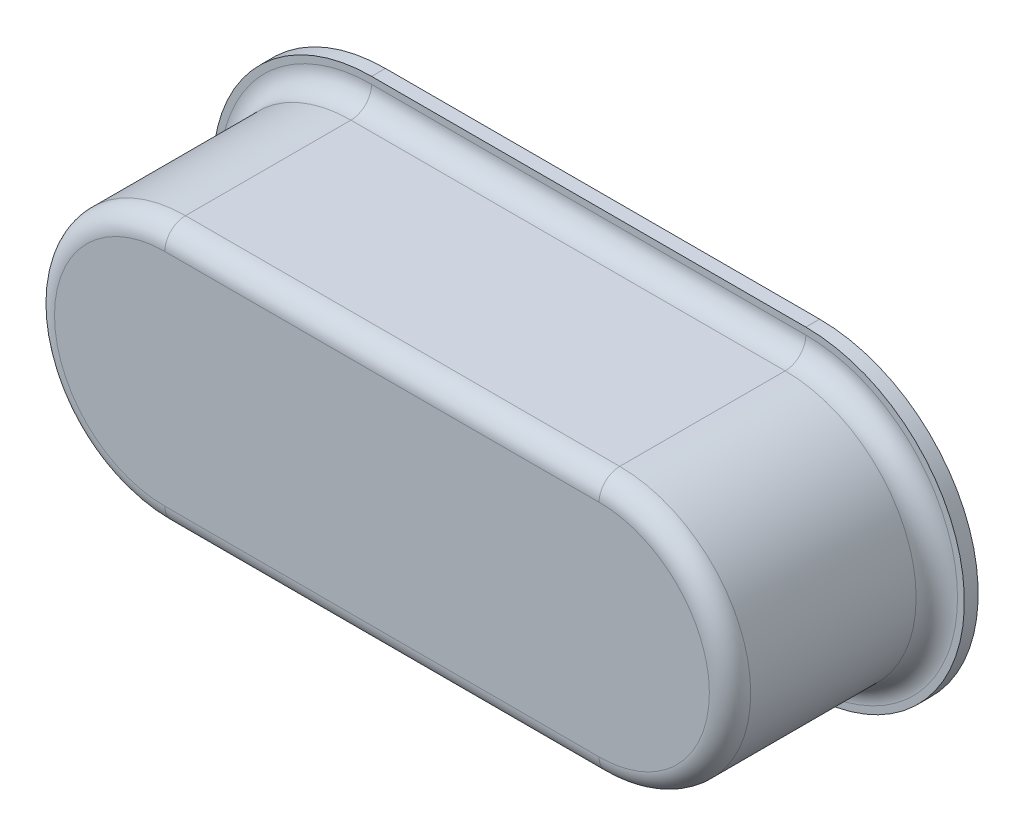
ISO-10303-21;
HEADER;
FILE_DESCRIPTION(('STEP AP214'),'2;1');
FILE_NAME('part.step','',(''),(''),'','','');
FILE_SCHEMA(('AUTOMOTIVE_DESIGN { 1 0 10303 214 1 1 1 1 }'));
ENDSEC;
DATA;
#1=APPLICATION_CONTEXT('core data for automotive mechanical design processes');
#2=APPLICATION_PROTOCOL_DEFINITION('international standard','automotive_design',2000,#1);
#3=PRODUCT_CONTEXT('',#1,'mechanical');
#4=PRODUCT('Part','Part','',(#3));
#5=PRODUCT_RELATED_PRODUCT_CATEGORY('part','',(#4));
#6=PRODUCT_DEFINITION_FORMATION('','',#4);
#7=PRODUCT_DEFINITION_CONTEXT('part definition',#1,'design');
#8=PRODUCT_DEFINITION('design','',#6,#7);
#9=PRODUCT_DEFINITION_SHAPE('','',#8);
#10=(LENGTH_UNIT() NAMED_UNIT(*) SI_UNIT(.MILLI.,.METRE.));
#11=(NAMED_UNIT(*) PLANE_ANGLE_UNIT() SI_UNIT($,.RADIAN.));
#12=(NAMED_UNIT(*) SI_UNIT($,.STERADIAN.) SOLID_ANGLE_UNIT());
#13=UNCERTAINTY_MEASURE_WITH_UNIT(LENGTH_MEASURE(1.E-05),#10,'distance_accuracy_value','');
#14=(GEOMETRIC_REPRESENTATION_CONTEXT(3) GLOBAL_UNCERTAINTY_ASSIGNED_CONTEXT((#13)) GLOBAL_UNIT_ASSIGNED_CONTEXT((#10,
#11,#12)) REPRESENTATION_CONTEXT('',''));
#15=CARTESIAN_POINT('',(0.,0.,0.));
#16=DIRECTION('',(0.,0.,1.));
#17=DIRECTION('',(1.,0.,0.));
#18=AXIS2_PLACEMENT_3D('',#15,#16,#17);
#19=CARTESIAN_POINT('',(-3.15,0.,4.));
#20=DIRECTION('',(0.,0.,1.));
#21=DIRECTION('',(1.,0.,0.));
#22=AXIS2_PLACEMENT_3D('',#19,#20,#21);
#23=PLANE('',#22);
#24=CARTESIAN_POINT('',(4.75,0.,4.));
#25=CARTESIAN_POINT('',(4.75000010977069,-0.0174532960022455,4.));
#26=CARTESIAN_POINT('',(4.74971442509499,-0.0349065857803312,4.));
#27=CARTESIAN_POINT('',(4.74857225482939,-0.069794479249352,4.));
#28=CARTESIAN_POINT('',(4.74771576923948,-0.087229082940287,4.));
#29=CARTESIAN_POINT('',(4.74543278512405,-0.122060930596172,4.));
#30=CARTESIAN_POINT('',(4.74400628659851,-0.139458174561122,4.));
#31=CARTESIAN_POINT('',(4.74058483875252,-0.174196674493472,4.));
#32=CARTESIAN_POINT('',(4.73858988943207,-0.191537930460873,4.));
#33=CARTESIAN_POINT('',(4.73403366696413,-0.226145884643291,4.));
#34=CARTESIAN_POINT('',(4.73147239381664,-0.243412582858308,4.));
#35=CARTESIAN_POINT('',(4.72578626885498,-0.277852932004375,4.));
#36=CARTESIAN_POINT('',(4.7226614170408,-0.295026582935424,4.));
#37=CARTESIAN_POINT('',(4.71585148024954,-0.329262447516187,4.));
#38=CARTESIAN_POINT('',(4.71216639527244,-0.346324661165901,4.));
#39=CARTESIAN_POINT('',(4.70423993841503,-0.380319380544095,4.));
#40=CARTESIAN_POINT('',(4.69999856653471,-0.397251886272575,4.));
#41=CARTESIAN_POINT('',(4.69096407759031,-0.430969058055493,4.));
#42=CARTESIAN_POINT('',(4.68617096052621,-0.44775372410993,4.));
#43=CARTESIAN_POINT('',(4.67603811381686,-0.481157243104352,4.));
#44=CARTESIAN_POINT('',(4.67069838417159,-0.497776096044336,4.));
#45=CARTESIAN_POINT('',(4.65947803021274,-0.530830192925783,4.));
#46=CARTESIAN_POINT('',(4.65359740589916,-0.547265436867246,4.));
#47=CARTESIAN_POINT('',(4.64130155972429,-0.579934716480705,4.));
#48=CARTESIAN_POINT('',(4.634886337863,-0.5961687521527,4.));
#49=CARTESIAN_POINT('',(4.62152816617311,-0.628418231415589,4.));
#50=CARTESIAN_POINT('',(4.61458521634451,-0.644433675006483,4.));
#51=CARTESIAN_POINT('',(4.60017902340325,-0.676228820367582,4.));
#52=CARTESIAN_POINT('',(4.5927157802906,-0.692008522137788,4.));
#53=CARTESIAN_POINT('',(4.57727699261401,-0.723315286563018,4.));
#54=CARTESIAN_POINT('',(4.56930144805007,-0.738842349218041,4.));
#55=CARTESIAN_POINT('',(4.55284659786467,-0.769627208625153,4.));
#56=CARTESIAN_POINT('',(4.5443672922432,-0.784885005377241,4.));
#57=CARTESIAN_POINT('',(4.526913999867,-0.815114994622759,4.));
#58=CARTESIAN_POINT('',(4.51794001311227,-0.830087187116189,4.));
#59=CARTESIAN_POINT('',(4.49950696777278,-0.85972993496499,4.));
#60=CARTESIAN_POINT('',(4.49004790918804,-0.874400490320362,3.99999999999999));
#61=CARTESIAN_POINT('',(4.47065485018011,-0.903424255342366,4.));
#62=CARTESIAN_POINT('',(4.46072084975693,-0.917777465008997,4.00000000000002));
#63=CARTESIAN_POINT('',(4.44038854093624,-0.946151164967971,3.99999999999998));
#64=CARTESIAN_POINT('',(4.42999023253874,-0.960171655260313,3.99999999999992));
#65=CARTESIAN_POINT('',(4.40874045639321,-0.987864917567594,4.00000000000008));
#66=CARTESIAN_POINT('',(4.39788898864517,-1.00153768958253,4.00000000000031));
#67=CARTESIAN_POINT('',(4.37574446211558,-1.02852081974113,3.99999999999969));
#68=CARTESIAN_POINT('',(4.36445140333403,-1.0418311778848,3.99999999999884));
#69=CARTESIAN_POINT('',(4.34143598059869,-1.06807543043543,4.00000000000116));
#70=CARTESIAN_POINT('',(4.3297136166449,-1.0810093248424,4.00000000000434));
#71=CARTESIAN_POINT('',(4.30585141598817,-1.10648604163079,3.99999999999566));
#72=CARTESIAN_POINT('',(4.29371157928523,-1.11902886401222,3.9999999999838));
#73=CARTESIAN_POINT('',(4.2685244970072,-1.14421851077046,4.00000000001686));
#74=CARTESIAN_POINT('',(4.25546045227167,-1.15684854068546,4.00000000006412));
#75=CARTESIAN_POINT('',(4.22891477116965,-1.18166182818993,3.99999999961358));
#76=CARTESIAN_POINT('',(4.21543313425486,-1.19384508519273,3.99999999911578));
#77=CARTESIAN_POINT('',(4.18806657907684,-1.21775032243384,3.99999999572757));
#78=CARTESIAN_POINT('',(4.17418165527758,-1.22947229633476,3.99999999283714));
#79=CARTESIAN_POINT('',(4.14602450893429,-1.25244225574636,3.99999998105727));
#80=CARTESIAN_POINT('',(4.13175227627046,-1.26369022885244,3.99999997216769));
#81=CARTESIAN_POINT('',(4.10283580708651,-1.28569849003149,3.99999994532574));
#82=CARTESIAN_POINT('',(4.08819155623854,-1.29645875927653,3.99999992737303));
#83=CARTESIAN_POINT('',(4.05854997688082,-1.31748318810887,3.99999987119474));
#84=CARTESIAN_POINT('',(4.04355263040594,-1.32774732237186,3.99999983296813));
#85=CARTESIAN_POINT('',(4.01323587380716,-1.34773867742504,3.99999974940706));
#86=CARTESIAN_POINT('',(3.99791697472497,-1.357466672489,3.99999970408323));
#87=CARTESIAN_POINT('',(3.96694537326438,-1.37637604468276,3.99999964372264));
#88=CARTESIAN_POINT('',(3.95129267014566,-1.38555742060008,3.99999962868595));
#89=CARTESIAN_POINT('',(3.91967602080263,-1.40336648548963,3.99999962951331));
#90=CARTESIAN_POINT('',(3.90371208500269,-1.41199419296495,3.99999964537632));
#91=CARTESIAN_POINT('',(3.87149144469668,-1.42868101919026,3.99999970278082));
#92=CARTESIAN_POINT('',(3.85523476049407,-1.43674017718261,3.99999974432053));
#93=CARTESIAN_POINT('',(3.82245366831295,-1.45229133375509,3.99999983855285));
#94=CARTESIAN_POINT('',(3.80592928855544,-1.45978339165376,3.99999989124429));
#95=CARTESIAN_POINT('',(3.77261797533825,-1.47414883404696,3.99999996682688));
#96=CARTESIAN_POINT('',(3.75583107906832,-1.48102230525897,3.99999998972222));
#97=CARTESIAN_POINT('',(3.71635353220262,-1.49654941352495,4.00000001375969));
#98=CARTESIAN_POINT('',(3.69358947392863,-1.50501725261556,4.00000000490451));
#99=CARTESIAN_POINT('',(3.64583880502861,-1.52152472952498,3.99999999216639));
#100=CARTESIAN_POINT('',(3.62082097443315,-1.52947480177838,3.99999998874189));
#101=CARTESIAN_POINT('',(3.57734337283766,-1.5421317893423,3.99999997059212));
#102=CARTESIAN_POINT('',(3.55896752071305,-1.54713006647686,3.99999995922513));
#103=CARTESIAN_POINT('',(3.52433174616512,-1.55588191616359,3.99999993909778));
#104=CARTESIAN_POINT('',(3.50809145298623,-1.55971297718457,3.99999993018893));
#105=CARTESIAN_POINT('',(3.47780051169748,-1.5663531600699,3.99999991801431));
#106=CARTESIAN_POINT('',(3.46376468780295,-1.56923019285811,3.99999991412908));
#107=CARTESIAN_POINT('',(3.43324031028107,-1.57505440882232,3.9999999106685));
#108=CARTESIAN_POINT('',(3.41673827139217,-1.57793121785972,3.99999991193284));
#109=CARTESIAN_POINT('',(3.3836518188667,-1.58316152502645,3.99999991727584));
#110=CARTESIAN_POINT('',(3.36706740623607,-1.58551502953039,3.99999992135446));
#111=CARTESIAN_POINT('',(3.33383262924117,-1.58969524195414,3.99999993241766));
#112=CARTESIAN_POINT('',(3.31718226626683,-1.59152196091694,3.99999993940218));
#113=CARTESIAN_POINT('',(3.28383254753917,-1.59464708463657,3.99999995455966));
#114=CARTESIAN_POINT('',(3.26713319325797,-1.59594550510763,3.99999996273258));
#115=CARTESIAN_POINT('',(3.23370237417473,-1.59801264303175,3.99999997822741));
#116=CARTESIAN_POINT('',(3.21697091063471,-1.59878138089252,3.99999998554935));
#117=CARTESIAN_POINT('',(3.18349282316435,-1.59978854594714,3.99999999637736));
#118=CARTESIAN_POINT('',(3.16674619998877,-1.60002699823055,3.99999999988362));
#119=CARTESIAN_POINT('',(3.15,-1.6,4.));
#120=B_SPLINE_CURVE_WITH_KNOTS('',3,(#24,#25,#26,#27,#28,#29,#30,#31,#32,#33,#34,#35,#36,#37,
#38,#39,#40,#41,#42,#43,#44,#45,#46,#47,#48,#49,#50,#51,#52,#53,#54,#55,#56,#57,#58,#59,#60,#61,
#62,#63,#64,#65,#66,#67,#68,#69,#70,#71,#72,#73,#74,#75,#76,#77,#78,#79,#80,#81,#82,#83,#84,#85,
#86,#87,#88,#89,#90,#91,#92,#93,#94,#95,#96,#97,#98,#99,#100,#101,#102,#103,#104,#105,#106,#107,
#108,#109,#110,#111,#112,#113,#114,#115,#116,#117,#118,#119),.UNSPECIFIED.,.F.,.F.,(4,2,2,2,2,2,
2,2,2,2,2,2,2,2,2,2,2,2,2,2,2,2,2,2,2,2,2,2,2,2,2,2,2,2,2,2,2,2,2,2,2,2,2,2,2,2,2,4),(0.,
0.0523575412047566,0.104715082409516,0.157072623614273,0.209430164819029,0.261787706023787,
0.314145247228547,0.366502788433305,0.418860329638061,0.471217870842821,0.523575412047577,
0.575932953252337,0.628290494457093,0.68064803566185,0.733005576866609,0.785363118071366,
0.837720659276123,0.890078200480882,0.942435741685639,0.994793282890397,1.04715082409515,
1.09950836529991,1.15186590650467,1.20422344770943,1.25658098891419,1.31108371964887,
1.36558652194861,1.42009007277799,1.47459504907836,1.52910212776716,1.58361198573716,
1.63804094048324,1.69247001595607,1.74689727151032,1.80132076670791,1.85573856133054,
1.9101487153933,1.98299196558938,2.06170810438995,2.11882756591547,2.16887693032146,
2.21185489508934,2.26209892756126,2.31234234795466,2.36258471502074,2.41282558751921,
2.46306452421848,2.51330108389596),.UNSPECIFIED.);
#121=CARTESIAN_POINT('',(4.75,0.,4.));
#122=VERTEX_POINT('',#121);
#123=CARTESIAN_POINT('',(3.15,-1.6,4.));
#124=VERTEX_POINT('',#123);
#125=EDGE_CURVE('E125',#122,#124,#120,.T.);
#126=ORIENTED_EDGE('',*,*,#125,.F.);
#127=CARTESIAN_POINT('',(3.15,1.6,4.));
#128=CARTESIAN_POINT('',(3.16828557699269,1.60000011479168,3.99999999980515));
#129=CARTESIAN_POINT('',(3.18657113712359,1.59968963754846,3.99999999999896));
#130=CARTESIAN_POINT('',(3.22312124287955,1.59844838348491,3.99999999971187));
#131=CARTESIAN_POINT('',(3.24138578844693,1.59751760496596,3.99999999923096));
#132=CARTESIAN_POINT('',(3.27787304836958,1.59503661487103,3.99999999614231));
#133=CARTESIAN_POINT('',(3.29609576211465,1.59348639431613,3.99999999353454));
#134=CARTESIAN_POINT('',(3.33247848759917,1.58976853858637,3.9999999830426));
#135=CARTESIAN_POINT('',(3.35063849768,1.58760088720402,3.99999997515829));
#136=CARTESIAN_POINT('',(3.38687544502578,1.58264975814967,3.99999995081388));
#137=CARTESIAN_POINT('',(3.40495237910708,1.57986625707462,3.99999993435345));
#138=CARTESIAN_POINT('',(3.43198902711926,1.57523386045183,3.99999989727424));
#139=CARTESIAN_POINT('',(3.44098843951015,1.57361347098075,3.999999882849));
#140=CARTESIAN_POINT('',(3.4589507511117,1.57021852006567,3.999999852555));
#141=CARTESIAN_POINT('',(3.46791367366786,1.56844408225044,3.99999983668739));
#142=CARTESIAN_POINT('',(3.49475323615122,1.56288311690037,3.99999979540103));
#143=CARTESIAN_POINT('',(3.51258120411127,1.55885884653545,3.99999977629741));
#144=CARTESIAN_POINT('',(3.54808384011912,1.55018551657002,3.99999976125795));
#145=CARTESIAN_POINT('',(3.56575851058789,1.54553646685558,3.99999976532174));
#146=CARTESIAN_POINT('',(3.6009311271481,1.53561554167753,3.99999979512661));
#147=CARTESIAN_POINT('',(3.61842908197629,1.53034369716985,3.9999998208666));
#148=CARTESIAN_POINT('',(3.65323036575008,1.51919593139758,3.99999988323248));
#149=CARTESIAN_POINT('',(3.67053371083403,1.51332006063879,3.99999991985747));
#150=CARTESIAN_POINT('',(3.70490680463616,1.50092813108426,3.99999997582968));
#151=CARTESIAN_POINT('',(3.72197658054346,1.49441214753708,3.99999999517893));
#152=CARTESIAN_POINT('',(3.74823661923945,1.48396864411282,4.00000000263706));
#153=CARTESIAN_POINT('',(3.75749333315976,1.48020573090504,4.00000000092736));
#154=CARTESIAN_POINT('',(3.78642386559242,1.46814092664129,3.99999999773363));
#155=CARTESIAN_POINT('',(3.8059755902883,1.4595426248697,3.99999999871624));
#156=CARTESIAN_POINT('',(3.84664259497911,1.44068300454628,3.99999998562315));
#157=CARTESIAN_POINT('',(3.86772054925518,1.43034132805912,3.99999997004381));
#158=CARTESIAN_POINT('',(3.91298891492952,1.40687919618383,3.99999992187595));
#159=CARTESIAN_POINT('',(3.93709063870694,1.39358682563235,3.99999988682146));
#160=CARTESIAN_POINT('',(3.97683814179472,1.37028955618997,3.99999983489549));
#161=CARTESIAN_POINT('',(3.99268301972124,1.36062271323932,3.99999981581929));
#162=CARTESIAN_POINT('',(4.01521278439546,1.34632191322741,3.99999979959412));
#163=CARTESIAN_POINT('',(4.02204092328979,1.34191279199552,3.99999979614714));
#164=CARTESIAN_POINT('',(4.03710570193166,1.33201837518206,3.99999979166302));
#165=CARTESIAN_POINT('',(4.04532562262463,1.32650761996385,3.99999979131322));
#166=CARTESIAN_POINT('',(4.06982779629793,1.309745791784,3.99999979382488));
#167=CARTESIAN_POINT('',(4.08595343444843,1.29826454255809,3.99999980024693));
#168=CARTESIAN_POINT('',(4.11776151999272,1.2747054920081,3.99999982270213));
#169=CARTESIAN_POINT('',(4.13344398179998,1.26262771012032,3.99999983873498));
#170=CARTESIAN_POINT('',(4.16434253265759,1.23789117893789,3.99999987587492));
#171=CARTESIAN_POINT('',(4.17955864460087,1.22523245823775,3.99999989698177));
#172=CARTESIAN_POINT('',(4.20950847990145,1.19935823625408,3.99999993877402));
#173=CARTESIAN_POINT('',(4.22424223492338,1.18614277164911,3.99999995945945));
#174=CARTESIAN_POINT('',(4.25318468525146,1.15915143800876,3.99999998892128));
#175=CARTESIAN_POINT('',(4.26739342371692,1.14537561523443,3.99999999769866));
#176=CARTESIAN_POINT('',(4.28909655855941,1.12363003013346,4.00000000127201));
#177=CARTESIAN_POINT('',(4.29675159952379,1.11581926664042,4.00000000056554));
#178=CARTESIAN_POINT('',(4.31903147095508,1.09263444254043,3.99999999888186));
#179=CARTESIAN_POINT('',(4.3334426366185,1.07705369444706,3.99999999827458));
#180=CARTESIAN_POINT('',(4.36259625757655,1.04425290227078,3.99999998371887));
#181=CARTESIAN_POINT('',(4.37729449547107,1.0269934632593,3.99999996886517));
#182=CARTESIAN_POINT('',(4.39533692928147,1.00487473588238,3.99999994101044));
#183=CARTESIAN_POINT('',(4.39902947457996,1.00029678077585,3.99999993478177));
#184=CARTESIAN_POINT('',(4.41617394517205,0.978797417460037,3.9999999046392));
#185=CARTESIAN_POINT('',(4.42930678085565,0.961619001738689,3.99999987799186));
#186=CARTESIAN_POINT('',(4.45305170272198,0.929202683268595,3.99999983250614));
#187=CARTESIAN_POINT('',(4.46375781537485,0.914033440858717,3.99999981309641));
#188=CARTESIAN_POINT('',(4.47876301693226,0.891948988155839,3.99999979666479));
#189=CARTESIAN_POINT('',(4.48328315883054,0.885183363344639,3.99999979319156));
#190=CARTESIAN_POINT('',(4.49318366543141,0.870112149980319,3.99999978868154));
#191=CARTESIAN_POINT('',(4.49853868977859,0.861789911272954,3.99999978833399));
#192=CARTESIAN_POINT('',(4.51436797858118,0.836675114566228,3.99999979091178));
#193=CARTESIAN_POINT('',(4.52460711073672,0.819733522807867,3.99999979745709));
#194=CARTESIAN_POINT('',(4.54444128324262,0.785478712384508,3.99999982023702));
#195=CARTESIAN_POINT('',(4.5540363447727,0.768165505964468,3.99999983647131));
#196=CARTESIAN_POINT('',(4.5725690126735,0.733191695842378,3.99999987422114));
#197=CARTESIAN_POINT('',(4.58150665163667,0.715531109417164,3.99999989573642));
#198=CARTESIAN_POINT('',(4.59871295334999,0.67988844262569,3.99999993779103));
#199=CARTESIAN_POINT('',(4.60698166042753,0.661906383658687,3.99999995833044));
#200=CARTESIAN_POINT('',(4.62283347892988,0.625644329795205,3.99999998935635));
#201=CARTESIAN_POINT('',(4.63041664722498,0.607364359761315,3.99999999984368));
#202=CARTESIAN_POINT('',(4.64435631699682,0.571935561598954,4.00000000014446));
#203=CARTESIAN_POINT('',(4.65076223448237,0.554806126320509,3.99999999146594));
#204=CARTESIAN_POINT('',(4.66300613241915,0.520346731080738,3.9999999769175));
#205=CARTESIAN_POINT('',(4.66884415103554,0.503016784682296,3.99999997104741));
#206=CARTESIAN_POINT('',(4.67994061018087,0.46817286163127,3.99999997000163));
#207=CARTESIAN_POINT('',(4.68519906656229,0.450658890026602,3.99999997482565));
#208=CARTESIAN_POINT('',(4.69513528685034,0.415466671780055,3.99999998716533));
#209=CARTESIAN_POINT('',(4.69981304347765,0.397788423081878,3.99999999468101));
#210=CARTESIAN_POINT('',(4.70857081133648,0.362283540260558,4.0000000041431));
#211=CARTESIAN_POINT('',(4.71265079121848,0.344456898406933,4.00000000608922));
#212=CARTESIAN_POINT('',(4.71835207471137,0.31762778593444,3.99999995404296));
#213=CARTESIAN_POINT('',(4.7201828014102,0.308669446369011,3.99999992753063));
#214=CARTESIAN_POINT('',(4.72252508112427,0.296532506443676,3.99999990725546));
#215=CARTESIAN_POINT('',(4.72312267698407,0.293370566805489,3.99999990340366));
#216=CARTESIAN_POINT('',(4.72631152090455,0.276172584883338,3.99999988897689));
#217=CARTESIAN_POINT('',(4.72869858010979,0.262098684634102,3.99999990076742));
#218=CARTESIAN_POINT('',(4.73470649893021,0.223566744123569,3.99999992916759));
#219=CARTESIAN_POINT('',(4.73795144987752,0.199048678346369,3.99999994298713));
#220=CARTESIAN_POINT('',(4.74146376955084,0.16670337174694,3.9999999616408));
#221=CARTESIAN_POINT('',(4.74224972267828,0.158929517009628,3.99999996615599));
#222=CARTESIAN_POINT('',(4.74474770935552,0.132276633396882,3.99999998000908));
#223=CARTESIAN_POINT('',(4.74618200007392,0.113370554877429,3.99999998704192));
#224=CARTESIAN_POINT('',(4.7483947669662,0.0752638252621297,3.99999999634645));
#225=CARTESIAN_POINT('',(4.74916410625308,0.0560626499235751,3.99999999855243));
#226=CARTESIAN_POINT('',(4.74986755509439,0.0245713634564666,4.00000000007139));
#227=CARTESIAN_POINT('',(4.75000279404424,0.0122855147648102,4.00000000014066));
#228=CARTESIAN_POINT('',(4.75,0.,4.));
#229=B_SPLINE_CURVE_WITH_KNOTS('',3,(#127,#128,#129,#130,#131,#132,#133,#134,#135,#136,#137,
#138,#139,#140,#141,#142,#143,#144,#145,#146,#147,#148,#149,#150,#151,#152,#153,#154,#155,#156,
#157,#158,#159,#160,#161,#162,#163,#164,#165,#166,#167,#168,#169,#170,#171,#172,#173,#174,#175,
#176,#177,#178,#179,#180,#181,#182,#183,#184,#185,#186,#187,#188,#189,#190,#191,#192,#193,#194,
#195,#196,#197,#198,#199,#200,#201,#202,#203,#204,#205,#206,#207,#208,#209,#210,#211,#212,#213,
#214,#215,#216,#217,#218,#219,#220,#221,#222,#223,#224,#225,#226,#227,#228),.UNSPECIFIED.,.F.,
.F.,(4,2,2,2,2,2,2,2,2,2,2,2,2,2,2,2,2,2,2,2,2,2,2,2,2,2,2,2,2,2,2,2,2,2,2,2,2,2,2,2,2,2,2,2,2,
2,2,2,2,2,4),(0.,0.054854065964237,0.109708282139468,0.164563293463837,0.219419744857423,
0.274278281221667,0.301709520507372,0.329118945321967,0.383936173130147,0.438752533650144,
0.493566170675304,0.548375228166244,0.603177850262233,0.633154186202212,0.697212344398245,
0.767625871881757,0.850158349285374,0.9058296128174,0.930212639780266,0.959899823445665,
1.01927074034508,1.07863972408767,1.13800578874508,1.19736794843318,1.25672521731346,
1.28953361567816,1.35318753379907,1.42117413171927,1.43881872175325,1.50366781748636,
1.55935649836993,1.58376564052106,1.61345288814373,1.67282392119965,1.73219300093341,
1.79155913539308,1.85092133267189,1.91027860090955,1.96513285302633,2.01998341615918,
2.07483247861786,2.12968222856383,2.18453485399392,2.21196387102942,2.22161752498581,
2.26443703870114,2.33860056820565,2.36204070620874,2.41890856022545,2.47654593075625,
2.51340243956686),.UNSPECIFIED.);
#230=CARTESIAN_POINT('',(3.15,1.6,4.));
#231=VERTEX_POINT('',#230);
#232=EDGE_CURVE('E116',#231,#122,#229,.T.);
#233=ORIENTED_EDGE('',*,*,#232,.F.);
#234=DIRECTION('',(1.,0.,0.));
#235=VECTOR('',#234,1.);
#236=CARTESIAN_POINT('',(-3.15,1.6,4.));
#237=LINE('',#236,#235);
#238=CARTESIAN_POINT('',(-3.15,1.6,4.));
#239=VERTEX_POINT('',#238);
#240=EDGE_CURVE('E109',#239,#231,#237,.T.);
#241=ORIENTED_EDGE('',*,*,#240,.F.);
#242=CARTESIAN_POINT('',(-3.15,0.,4.));
#243=DIRECTION('',(0.,0.,1.));
#244=DIRECTION('',(1.,0.,0.));
#245=AXIS2_PLACEMENT_3D('',#242,#243,#244);
#246=CIRCLE('',#245,1.6);
#247=CARTESIAN_POINT('',(-3.15,-1.6,4.));
#248=VERTEX_POINT('',#247);
#249=EDGE_CURVE('E21',#248,#239,#246,.F.);
#250=ORIENTED_EDGE('',*,*,#249,.F.);
#251=DIRECTION('',(-1.,0.,0.));
#252=VECTOR('',#251,1.);
#253=CARTESIAN_POINT('',(-3.15,-1.6,4.));
#254=LINE('',#253,#252);
#255=EDGE_CURVE('E90',#124,#248,#254,.T.);
#256=ORIENTED_EDGE('',*,*,#255,.F.);
#257=EDGE_LOOP('',(#126,#233,#241,#250,#256));
#258=FACE_BOUND('',#257,.T.);
#259=ADVANCED_FACE('F17',(#258),#23,.T.);
#260=CARTESIAN_POINT('',(-3.15,-1.6,3.7));
#261=DIRECTION('',(-1.,0.,0.));
#262=DIRECTION('',(0.,0.,1.));
#263=AXIS2_PLACEMENT_3D('',#260,#261,#262);
#264=CYLINDRICAL_SURFACE('',#263,0.3);
#265=CARTESIAN_POINT('',(-3.15,-1.6,3.7));
#266=DIRECTION('',(-1.,0.,0.));
#267=DIRECTION('',(0.,0.,1.));
#268=AXIS2_PLACEMENT_3D('',#265,#266,#267);
#269=CIRCLE('',#268,0.299999999999998);
#270=CARTESIAN_POINT('',(-3.15,-1.9,3.7));
#271=VERTEX_POINT('',#270);
#272=EDGE_CURVE('E102',#271,#248,#269,.T.);
#273=ORIENTED_EDGE('',*,*,#272,.F.);
#274=DIRECTION('',(1.,0.,0.));
#275=VECTOR('',#274,1.);
#276=CARTESIAN_POINT('',(-3.15,-1.9,3.7));
#277=LINE('',#276,#275);
#278=CARTESIAN_POINT('',(3.15,-1.9,3.7));
#279=VERTEX_POINT('',#278);
#280=EDGE_CURVE('E270',#271,#279,#277,.T.);
#281=ORIENTED_EDGE('',*,*,#280,.T.);
#282=CARTESIAN_POINT('',(3.15,-1.6,3.7));
#283=DIRECTION('',(1.,0.,0.));
#284=DIRECTION('',(0.,0.,1.));
#285=AXIS2_PLACEMENT_3D('',#282,#283,#284);
#286=CIRCLE('',#285,0.299999999999998);
#287=EDGE_CURVE('E279',#124,#279,#286,.T.);
#288=ORIENTED_EDGE('',*,*,#287,.F.);
#289=ORIENTED_EDGE('',*,*,#255,.T.);
#290=EDGE_LOOP('',(#273,#281,#288,#289));
#291=FACE_BOUND('',#290,.T.);
#292=ADVANCED_FACE('F315',(#291),#264,.T.);
#293=CARTESIAN_POINT('',(-3.15,0.,3.7));
#294=DIRECTION('',(0.,0.,1.));
#295=DIRECTION('',(1.,0.,0.));
#296=AXIS2_PLACEMENT_3D('',#293,#294,#295);
#297=TOROIDAL_SURFACE('',#296,1.6,0.299999999999998);
#298=CARTESIAN_POINT('',(-3.15,0.,3.7));
#299=DIRECTION('',(0.,0.,-1.));
#300=DIRECTION('',(-1.,0.,0.));
#301=AXIS2_PLACEMENT_3D('',#298,#299,#300);
#302=CIRCLE('',#301,1.9);
#303=CARTESIAN_POINT('',(-3.15,1.9,3.7));
#304=VERTEX_POINT('',#303);
#305=EDGE_CURVE('E269',#271,#304,#302,.T.);
#306=ORIENTED_EDGE('',*,*,#305,.F.);
#307=ORIENTED_EDGE('',*,*,#272,.T.);
#308=ORIENTED_EDGE('',*,*,#249,.T.);
#309=CARTESIAN_POINT('',(-3.15,1.6,3.7));
#310=DIRECTION('',(1.,0.,0.));
#311=DIRECTION('',(0.,0.,-1.));
#312=AXIS2_PLACEMENT_3D('',#309,#310,#311);
#313=CIRCLE('',#312,0.3);
#314=EDGE_CURVE('E100',#304,#239,#313,.T.);
#315=ORIENTED_EDGE('',*,*,#314,.F.);
#316=EDGE_LOOP('',(#306,#307,#308,#315));
#317=FACE_BOUND('',#316,.T.);
#318=ADVANCED_FACE('F98',(#317),#297,.T.);
#319=CARTESIAN_POINT('',(-3.15,1.6,3.7));
#320=DIRECTION('',(1.,0.,0.));
#321=DIRECTION('',(0.,0.,-1.));
#322=AXIS2_PLACEMENT_3D('',#319,#320,#321);
#323=CYLINDRICAL_SURFACE('',#322,0.3);
#324=ORIENTED_EDGE('',*,*,#314,.T.);
#325=ORIENTED_EDGE('',*,*,#240,.T.);
#326=CARTESIAN_POINT('',(3.15,1.6,3.7));
#327=DIRECTION('',(1.,0.,0.));
#328=DIRECTION('',(0.,0.,1.));
#329=AXIS2_PLACEMENT_3D('',#326,#327,#328);
#330=CIRCLE('',#329,0.3);
#331=CARTESIAN_POINT('',(3.15,1.9,3.7));
#332=VERTEX_POINT('',#331);
#333=EDGE_CURVE('E118',#332,#231,#330,.T.);
#334=ORIENTED_EDGE('',*,*,#333,.F.);
#335=DIRECTION('',(1.,0.,0.));
#336=VECTOR('',#335,1.);
#337=CARTESIAN_POINT('',(-3.15,1.9,3.7));
#338=LINE('',#337,#336);
#339=EDGE_CURVE('E112',#332,#304,#338,.F.);
#340=ORIENTED_EDGE('',*,*,#339,.T.);
#341=EDGE_LOOP('',(#324,#325,#334,#340));
#342=FACE_BOUND('',#341,.T.);
#343=ADVANCED_FACE('F107',(#342),#323,.T.);
#344=CARTESIAN_POINT('',(3.15,0.,3.7));
#345=DIRECTION('',(0.,0.,1.));
#346=DIRECTION('',(1.,0.,0.));
#347=AXIS2_PLACEMENT_3D('',#344,#345,#346);
#348=TOROIDAL_SURFACE('',#347,1.6,0.299999999999998);
#349=ORIENTED_EDGE('',*,*,#287,.T.);
#350=CARTESIAN_POINT('',(3.15,0.,3.7));
#351=DIRECTION('',(0.,0.,-1.));
#352=DIRECTION('',(-1.,0.,0.));
#353=AXIS2_PLACEMENT_3D('',#350,#351,#352);
#354=CIRCLE('',#353,1.9);
#355=EDGE_CURVE('E249',#332,#279,#354,.T.);
#356=ORIENTED_EDGE('',*,*,#355,.F.);
#357=ORIENTED_EDGE('',*,*,#333,.T.);
#358=ORIENTED_EDGE('',*,*,#232,.T.);
#359=ORIENTED_EDGE('',*,*,#125,.T.);
#360=EDGE_LOOP('',(#349,#356,#357,#358,#359));
#361=FACE_BOUND('',#360,.T.);
#362=ADVANCED_FACE('F136',(#361),#348,.T.);
#363=CARTESIAN_POINT('',(-3.15,-1.9,4.));
#364=DIRECTION('',(0.,1.,0.));
#365=DIRECTION('',(0.,0.,1.));
#366=AXIS2_PLACEMENT_3D('',#363,#364,#365);
#367=PLANE('',#366);
#368=DIRECTION('',(0.,0.,-1.));
#369=VECTOR('',#368,1.);
#370=CARTESIAN_POINT('',(3.15,-1.9,4.));
#371=LINE('',#370,#369);
#372=CARTESIAN_POINT('',(3.15,-1.9,1.3));
#373=VERTEX_POINT('',#372);
#374=EDGE_CURVE('E263',#279,#373,#371,.T.);
#375=ORIENTED_EDGE('',*,*,#374,.F.);
#376=ORIENTED_EDGE('',*,*,#280,.F.);
#377=DIRECTION('',(0.,0.,-1.));
#378=VECTOR('',#377,1.);
#379=CARTESIAN_POINT('',(-3.15,-1.9,4.));
#380=LINE('',#379,#378);
#381=CARTESIAN_POINT('',(-3.15,-1.9,1.3));
#382=VERTEX_POINT('',#381);
#383=EDGE_CURVE('E266',#382,#271,#380,.F.);
#384=ORIENTED_EDGE('',*,*,#383,.F.);
#385=DIRECTION('',(1.,0.,0.));
#386=VECTOR('',#385,1.);
#387=CARTESIAN_POINT('',(-3.15,-1.9,1.3));
#388=LINE('',#387,#386);
#389=EDGE_CURVE('E235',#382,#373,#388,.T.);
#390=ORIENTED_EDGE('',*,*,#389,.T.);
#391=EDGE_LOOP('',(#375,#376,#384,#390));
#392=FACE_BOUND('',#391,.T.);
#393=ADVANCED_FACE('F139',(#392),#367,.F.);
#394=CARTESIAN_POINT('',(-3.15,0.,4.));
#395=DIRECTION('',(0.,0.,-1.));
#396=DIRECTION('',(-1.,0.,0.));
#397=AXIS2_PLACEMENT_3D('',#394,#395,#396);
#398=CYLINDRICAL_SURFACE('',#397,1.9);
#399=DIRECTION('',(0.,0.,-1.));
#400=VECTOR('',#399,1.);
#401=CARTESIAN_POINT('',(-3.15,1.9,4.));
#402=LINE('',#401,#400);
#403=CARTESIAN_POINT('',(-3.15,1.9,1.3));
#404=VERTEX_POINT('',#403);
#405=EDGE_CURVE('E250',#304,#404,#402,.T.);
#406=ORIENTED_EDGE('',*,*,#405,.T.);
#407=CARTESIAN_POINT('',(-3.15,0.,1.3));
#408=DIRECTION('',(0.,0.,1.));
#409=DIRECTION('',(0.,1.,0.));
#410=AXIS2_PLACEMENT_3D('',#407,#408,#409);
#411=CIRCLE('',#410,1.9);
#412=EDGE_CURVE('E229',#404,#382,#411,.T.);
#413=ORIENTED_EDGE('',*,*,#412,.T.);
#414=ORIENTED_EDGE('',*,*,#383,.T.);
#415=ORIENTED_EDGE('',*,*,#305,.T.);
#416=EDGE_LOOP('',(#406,#413,#414,#415));
#417=FACE_BOUND('',#416,.T.);
#418=ADVANCED_FACE('F304',(#417),#398,.T.);
#419=CARTESIAN_POINT('',(-3.15,1.9,4.));
#420=DIRECTION('',(0.,-1.,0.));
#421=DIRECTION('',(0.,0.,-1.));
#422=AXIS2_PLACEMENT_3D('',#419,#420,#421);
#423=PLANE('',#422);
#424=ORIENTED_EDGE('',*,*,#405,.F.);
#425=ORIENTED_EDGE('',*,*,#339,.F.);
#426=DIRECTION('',(0.,0.,-1.));
#427=VECTOR('',#426,1.);
#428=CARTESIAN_POINT('',(3.15,1.9,4.));
#429=LINE('',#428,#427);
#430=CARTESIAN_POINT('',(3.15,1.9,1.3));
#431=VERTEX_POINT('',#430);
#432=EDGE_CURVE('E246',#431,#332,#429,.F.);
#433=ORIENTED_EDGE('',*,*,#432,.F.);
#434=DIRECTION('',(-1.,0.,0.));
#435=VECTOR('',#434,1.);
#436=CARTESIAN_POINT('',(-3.15,1.9,1.3));
#437=LINE('',#436,#435);
#438=EDGE_CURVE('E224',#431,#404,#437,.T.);
#439=ORIENTED_EDGE('',*,*,#438,.T.);
#440=EDGE_LOOP('',(#424,#425,#433,#439));
#441=FACE_BOUND('',#440,.T.);
#442=ADVANCED_FACE('F329',(#441),#423,.F.);
#443=CARTESIAN_POINT('',(3.15,0.,4.));
#444=DIRECTION('',(0.,0.,-1.));
#445=DIRECTION('',(-1.,0.,0.));
#446=AXIS2_PLACEMENT_3D('',#443,#444,#445);
#447=CYLINDRICAL_SURFACE('',#446,1.9);
#448=ORIENTED_EDGE('',*,*,#374,.T.);
#449=CARTESIAN_POINT('',(3.15,0.,1.3));
#450=DIRECTION('',(0.,0.,1.));
#451=DIRECTION('',(1.,0.,0.));
#452=AXIS2_PLACEMENT_3D('',#449,#450,#451);
#453=CIRCLE('',#452,1.9);
#454=EDGE_CURVE('E219',#373,#431,#453,.T.);
#455=ORIENTED_EDGE('',*,*,#454,.T.);
#456=ORIENTED_EDGE('',*,*,#432,.T.);
#457=ORIENTED_EDGE('',*,*,#355,.T.);
#458=EDGE_LOOP('',(#448,#455,#456,#457));
#459=FACE_BOUND('',#458,.T.);
#460=ADVANCED_FACE('F153',(#459),#447,.T.);
#461=CARTESIAN_POINT('',(-3.15,-2.2,1.3));
#462=DIRECTION('',(1.,0.,0.));
#463=DIRECTION('',(0.,0.,-1.));
#464=AXIS2_PLACEMENT_3D('',#461,#462,#463);
#465=CYLINDRICAL_SURFACE('',#464,0.3);
#466=CARTESIAN_POINT('',(3.15,-2.2,1.3));
#467=DIRECTION('',(1.,0.,0.));
#468=DIRECTION('',(0.,0.,-1.));
#469=AXIS2_PLACEMENT_3D('',#466,#467,#468);
#470=CIRCLE('',#469,0.3);
#471=CARTESIAN_POINT('',(3.15,-2.2,1.));
#472=VERTEX_POINT('',#471);
#473=EDGE_CURVE('E230',#373,#472,#470,.F.);
#474=ORIENTED_EDGE('',*,*,#473,.F.);
#475=ORIENTED_EDGE('',*,*,#389,.F.);
#476=CARTESIAN_POINT('',(-3.15,-2.2,1.3));
#477=DIRECTION('',(-1.,0.,0.));
#478=DIRECTION('',(0.,0.,-1.));
#479=AXIS2_PLACEMENT_3D('',#476,#477,#478);
#480=CIRCLE('',#479,0.3);
#481=CARTESIAN_POINT('',(-3.15,-2.2,1.));
#482=VERTEX_POINT('',#481);
#483=EDGE_CURVE('E227',#382,#482,#480,.T.);
#484=ORIENTED_EDGE('',*,*,#483,.T.);
#485=DIRECTION('',(1.,0.,0.));
#486=VECTOR('',#485,1.);
#487=CARTESIAN_POINT('',(-3.15,-2.2,1.));
#488=LINE('',#487,#486);
#489=EDGE_CURVE('E195',#472,#482,#488,.F.);
#490=ORIENTED_EDGE('',*,*,#489,.F.);
#491=EDGE_LOOP('',(#474,#475,#484,#490));
#492=FACE_BOUND('',#491,.T.);
#493=ADVANCED_FACE('F144',(#492),#465,.F.);
#494=CARTESIAN_POINT('',(-3.15,0.,1.3));
#495=DIRECTION('',(0.,0.,1.));
#496=DIRECTION('',(1.,0.,0.));
#497=AXIS2_PLACEMENT_3D('',#494,#495,#496);
#498=TOROIDAL_SURFACE('',#497,2.2,0.3);
#499=CARTESIAN_POINT('',(-3.15,2.2,1.3));
#500=DIRECTION('',(-1.,0.,0.));
#501=DIRECTION('',(0.,0.,1.));
#502=AXIS2_PLACEMENT_3D('',#499,#500,#501);
#503=CIRCLE('',#502,0.3);
#504=CARTESIAN_POINT('',(-3.15,2.2,1.));
#505=VERTEX_POINT('',#504);
#506=EDGE_CURVE('E222',#404,#505,#503,.F.);
#507=ORIENTED_EDGE('',*,*,#506,.T.);
#508=CARTESIAN_POINT('',(-3.15,-2.2,1.));
#509=CARTESIAN_POINT('',(-3.56915119986748,-2.2,1.));
#510=CARTESIAN_POINT('',(-3.9598083610361,-2.04553426233736,1.));
#511=CARTESIAN_POINT('',(-4.38260971790573,-1.87835871824066,1.));
#512=CARTESIAN_POINT('',(-4.70563491861039,-1.55563491861042,1.));
#513=CARTESIAN_POINT('',(-5.02721690125002,-1.23435299043981,1.));
#514=CARTESIAN_POINT('',(-5.19553426233734,-0.809808361036144,1.));
#515=CARTESIAN_POINT('',(-5.34980415939055,-0.420695462345758,1.));
#516=CARTESIAN_POINT('',(-5.35,0.,1.));
#517=CARTESIAN_POINT('',(-5.35019489227943,0.418658305012789,1.));
#518=CARTESIAN_POINT('',(-5.19553426233736,0.80980836103609,1.));
#519=CARTESIAN_POINT('',(-5.02835871504815,1.23260972110035,1.));
#520=CARTESIAN_POINT('',(-4.70563491861043,1.55563491861038,1.));
#521=CARTESIAN_POINT('',(-4.38435285660123,1.87721703521448,1.));
#522=CARTESIAN_POINT('',(-3.95980836103616,2.04553426233733,1.));
#523=CARTESIAN_POINT('',(-3.57020130892961,2.2,1.));
#524=CARTESIAN_POINT('',(-3.15,2.2,1.));
#525=B_SPLINE_CURVE_WITH_KNOTS('',2,(#508,#509,#510,#511,#512,#513,#514,#515,#516,#517,#518,
#519,#520,#521,#522,#523,#524),.UNSPECIFIED.,.F.,.F.,(3,2,2,2,2,2,2,2,3),(0.,0.125,0.25,0.375,
0.5,0.625,0.75,0.875,1.),.UNSPECIFIED.);
#526=EDGE_CURVE('E199',#482,#505,#525,.T.);
#527=ORIENTED_EDGE('',*,*,#526,.F.);
#528=ORIENTED_EDGE('',*,*,#483,.F.);
#529=ORIENTED_EDGE('',*,*,#412,.F.);
#530=EDGE_LOOP('',(#507,#527,#528,#529));
#531=FACE_BOUND('',#530,.T.);
#532=ADVANCED_FACE('F141',(#531),#498,.F.);
#533=CARTESIAN_POINT('',(-3.15,2.2,1.3));
#534=DIRECTION('',(-1.,0.,0.));
#535=DIRECTION('',(0.,0.,1.));
#536=AXIS2_PLACEMENT_3D('',#533,#534,#535);
#537=CYLINDRICAL_SURFACE('',#536,0.3);
#538=ORIENTED_EDGE('',*,*,#506,.F.);
#539=ORIENTED_EDGE('',*,*,#438,.F.);
#540=CARTESIAN_POINT('',(3.15,2.2,1.3));
#541=DIRECTION('',(1.,0.,0.));
#542=DIRECTION('',(0.,0.,-1.));
#543=AXIS2_PLACEMENT_3D('',#540,#541,#542);
#544=CIRCLE('',#543,0.3);
#545=CARTESIAN_POINT('',(3.15,2.2,1.));
#546=VERTEX_POINT('',#545);
#547=EDGE_CURVE('E196',#431,#546,#544,.T.);
#548=ORIENTED_EDGE('',*,*,#547,.T.);
#549=DIRECTION('',(1.,0.,0.));
#550=VECTOR('',#549,1.);
#551=CARTESIAN_POINT('',(-3.15,2.2,1.));
#552=LINE('',#551,#550);
#553=EDGE_CURVE('E206',#505,#546,#552,.T.);
#554=ORIENTED_EDGE('',*,*,#553,.F.);
#555=EDGE_LOOP('',(#538,#539,#548,#554));
#556=FACE_BOUND('',#555,.T.);
#557=ADVANCED_FACE('F143',(#556),#537,.F.);
#558=CARTESIAN_POINT('',(3.15,0.,1.3));
#559=DIRECTION('',(0.,0.,1.));
#560=DIRECTION('',(1.,0.,0.));
#561=AXIS2_PLACEMENT_3D('',#558,#559,#560);
#562=TOROIDAL_SURFACE('',#561,2.2,0.3);
#563=CARTESIAN_POINT('',(3.15,2.2,1.));
#564=CARTESIAN_POINT('',(3.56915107815492,2.2,1.));
#565=CARTESIAN_POINT('',(3.95980836103612,2.04553426233735,1.));
#566=CARTESIAN_POINT('',(4.38260949889332,1.87835885692303,1.));
#567=CARTESIAN_POINT('',(4.7056349186104,1.5556349186104,1.));
#568=CARTESIAN_POINT('',(5.02721686408614,1.23435310733666,1.));
#569=CARTESIAN_POINT('',(5.19553426233735,0.809808361036117,1.));
#570=CARTESIAN_POINT('',(5.35,0.420201474941996,1.));
#571=CARTESIAN_POINT('',(5.35,0.,1.));
#572=B_SPLINE_CURVE_WITH_KNOTS('',2,(#563,#564,#565,#566,#567,#568,#569,#570,#571),
.UNSPECIFIED.,.F.,.F.,(3,2,2,2,3),(0.,0.25,0.5,0.75,1.),.UNSPECIFIED.);
#573=CARTESIAN_POINT('',(5.35,0.,1.));
#574=VERTEX_POINT('',#573);
#575=EDGE_CURVE('E187',#546,#574,#572,.T.);
#576=ORIENTED_EDGE('',*,*,#575,.F.);
#577=ORIENTED_EDGE('',*,*,#547,.F.);
#578=ORIENTED_EDGE('',*,*,#454,.F.);
#579=ORIENTED_EDGE('',*,*,#473,.T.);
#580=CARTESIAN_POINT('',(5.35,0.,1.));
#581=CARTESIAN_POINT('',(5.35,-0.419151078153229,1.));
#582=CARTESIAN_POINT('',(5.19553426233735,-0.80980836103611,1.));
#583=CARTESIAN_POINT('',(5.02835885692416,-1.23260949889229,1.));
#584=CARTESIAN_POINT('',(4.70563491861041,-1.5556349186104,1.));
#585=CARTESIAN_POINT('',(4.38435310733455,-1.87721686408815,1.));
#586=CARTESIAN_POINT('',(3.95980836103613,-2.04553426233734,1.));
#587=CARTESIAN_POINT('',(3.57020147493927,-2.2,1.));
#588=CARTESIAN_POINT('',(3.15,-2.2,1.));
#589=B_SPLINE_CURVE_WITH_KNOTS('',2,(#580,#581,#582,#583,#584,#585,#586,#587,#588),
.UNSPECIFIED.,.F.,.F.,(3,2,2,2,3),(0.,0.25,0.5,0.75,1.),.UNSPECIFIED.);
#590=EDGE_CURVE('E192',#574,#472,#589,.T.);
#591=ORIENTED_EDGE('',*,*,#590,.F.);
#592=EDGE_LOOP('',(#576,#577,#578,#579,#591));
#593=FACE_BOUND('',#592,.T.);
#594=ADVANCED_FACE('F19',(#593),#562,.F.);
#595=CARTESIAN_POINT('',(-3.15,0.,1.));
#596=DIRECTION('',(0.,0.,1.));
#597=DIRECTION('',(1.,0.,0.));
#598=AXIS2_PLACEMENT_3D('',#595,#596,#597);
#599=PLANE('',#598);
#600=ORIENTED_EDGE('',*,*,#553,.T.);
#601=ORIENTED_EDGE('',*,*,#575,.T.);
#602=ORIENTED_EDGE('',*,*,#590,.T.);
#603=ORIENTED_EDGE('',*,*,#489,.T.);
#604=ORIENTED_EDGE('',*,*,#526,.T.);
#605=EDGE_LOOP('',(#600,#601,#602,#603,#604));
#606=FACE_BOUND('',#605,.T.);
#607=CARTESIAN_POINT('',(-3.15,0.,1.));
#608=DIRECTION('',(0.,0.,-1.));
#609=DIRECTION('',(-1.,0.,0.));
#610=AXIS2_PLACEMENT_3D('',#607,#608,#609);
#611=CIRCLE('',#610,2.3);
#612=CARTESIAN_POINT('',(-3.15,-2.3,1.));
#613=VERTEX_POINT('',#612);
#614=CARTESIAN_POINT('',(-3.15,2.3,1.));
#615=VERTEX_POINT('',#614);
#616=EDGE_CURVE('E362',#613,#615,#611,.T.);
#617=ORIENTED_EDGE('',*,*,#616,.F.);
#618=DIRECTION('',(1.,0.,0.));
#619=VECTOR('',#618,1.);
#620=CARTESIAN_POINT('',(-3.15,-2.3,1.));
#621=LINE('',#620,#619);
#622=CARTESIAN_POINT('',(3.15,-2.3,1.));
#623=VERTEX_POINT('',#622);
#624=EDGE_CURVE('E197',#613,#623,#621,.T.);
#625=ORIENTED_EDGE('',*,*,#624,.T.);
#626=CARTESIAN_POINT('',(3.15,0.,1.));
#627=DIRECTION('',(0.,0.,-1.));
#628=DIRECTION('',(-1.,0.,0.));
#629=AXIS2_PLACEMENT_3D('',#626,#627,#628);
#630=CIRCLE('',#629,2.3);
#631=CARTESIAN_POINT('',(3.15,2.3,1.));
#632=VERTEX_POINT('',#631);
#633=EDGE_CURVE('E373',#632,#623,#630,.T.);
#634=ORIENTED_EDGE('',*,*,#633,.F.);
#635=DIRECTION('',(1.,0.,0.));
#636=VECTOR('',#635,1.);
#637=CARTESIAN_POINT('',(-3.15,2.3,1.));
#638=LINE('',#637,#636);
#639=EDGE_CURVE('E357',#632,#615,#638,.F.);
#640=ORIENTED_EDGE('',*,*,#639,.T.);
#641=EDGE_LOOP('',(#617,#625,#634,#640));
#642=FACE_BOUND('',#641,.T.);
#643=ADVANCED_FACE('F179',(#606,#642),#599,.T.);
#644=CARTESIAN_POINT('',(-3.15,2.3,1.));
#645=DIRECTION('',(0.,-1.,0.));
#646=DIRECTION('',(0.,0.,-1.));
#647=AXIS2_PLACEMENT_3D('',#644,#645,#646);
#648=PLANE('',#647);
#649=ORIENTED_EDGE('',*,*,#639,.F.);
#650=DIRECTION('',(0.,0.,-1.));
#651=VECTOR('',#650,1.);
#652=CARTESIAN_POINT('',(3.15,2.3,1.));
#653=LINE('',#652,#651);
#654=CARTESIAN_POINT('',(3.15,2.3,0.8));
#655=VERTEX_POINT('',#654);
#656=EDGE_CURVE('E368',#655,#632,#653,.F.);
#657=ORIENTED_EDGE('',*,*,#656,.F.);
#658=DIRECTION('',(1.,0.,0.));
#659=VECTOR('',#658,1.);
#660=CARTESIAN_POINT('',(-7.02577935402385,2.3,0.8));
#661=LINE('',#660,#659);
#662=CARTESIAN_POINT('',(-3.15,2.3,0.8));
#663=VERTEX_POINT('',#662);
#664=EDGE_CURVE('E371',#655,#663,#661,.F.);
#665=ORIENTED_EDGE('',*,*,#664,.T.);
#666=DIRECTION('',(0.,0.,-1.));
#667=VECTOR('',#666,1.);
#668=CARTESIAN_POINT('',(-3.15,2.3,1.));
#669=LINE('',#668,#667);
#670=EDGE_CURVE('E359',#615,#663,#669,.T.);
#671=ORIENTED_EDGE('',*,*,#670,.F.);
#672=EDGE_LOOP('',(#649,#657,#665,#671));
#673=FACE_BOUND('',#672,.T.);
#674=ADVANCED_FACE('F175',(#673),#648,.F.);
#675=CARTESIAN_POINT('',(-3.15,0.,1.));
#676=DIRECTION('',(0.,0.,-1.));
#677=DIRECTION('',(-1.,0.,0.));
#678=AXIS2_PLACEMENT_3D('',#675,#676,#677);
#679=CYLINDRICAL_SURFACE('',#678,2.3);
#680=CARTESIAN_POINT('',(-3.15,0.,0.8));
#681=DIRECTION('',(0.,0.,-1.));
#682=DIRECTION('',(-1.,0.,0.));
#683=AXIS2_PLACEMENT_3D('',#680,#681,#682);
#684=CIRCLE('',#683,2.3);
#685=CARTESIAN_POINT('',(-3.15,-2.3,0.8));
#686=VERTEX_POINT('',#685);
#687=EDGE_CURVE('E376',#663,#686,#684,.F.);
#688=ORIENTED_EDGE('',*,*,#687,.T.);
#689=DIRECTION('',(0.,0.,1.));
#690=VECTOR('',#689,1.);
#691=CARTESIAN_POINT('',(-3.15,-2.3,1.));
#692=LINE('',#691,#690);
#693=EDGE_CURVE('E365',#686,#613,#692,.T.);
#694=ORIENTED_EDGE('',*,*,#693,.T.);
#695=ORIENTED_EDGE('',*,*,#616,.T.);
#696=ORIENTED_EDGE('',*,*,#670,.T.);
#697=EDGE_LOOP('',(#688,#694,#695,#696));
#698=FACE_BOUND('',#697,.T.);
#699=ADVANCED_FACE('F171',(#698),#679,.T.);
#700=CARTESIAN_POINT('',(-3.15,-2.3,1.));
#701=DIRECTION('',(0.,1.,0.));
#702=DIRECTION('',(0.,0.,1.));
#703=AXIS2_PLACEMENT_3D('',#700,#701,#702);
#704=PLANE('',#703);
#705=ORIENTED_EDGE('',*,*,#624,.F.);
#706=ORIENTED_EDGE('',*,*,#693,.F.);
#707=DIRECTION('',(1.,0.,0.));
#708=VECTOR('',#707,1.);
#709=CARTESIAN_POINT('',(-7.02577935402385,-2.3,0.8));
#710=LINE('',#709,#708);
#711=CARTESIAN_POINT('',(3.15,-2.3,0.8));
#712=VERTEX_POINT('',#711);
#713=EDGE_CURVE('E27',#686,#712,#710,.T.);
#714=ORIENTED_EDGE('',*,*,#713,.T.);
#715=DIRECTION('',(0.,0.,-1.));
#716=VECTOR('',#715,1.);
#717=CARTESIAN_POINT('',(3.15,-2.3,1.));
#718=LINE('',#717,#716);
#719=EDGE_CURVE('E35',#623,#712,#718,.T.);
#720=ORIENTED_EDGE('',*,*,#719,.F.);
#721=EDGE_LOOP('',(#705,#706,#714,#720));
#722=FACE_BOUND('',#721,.T.);
#723=ADVANCED_FACE('F165',(#722),#704,.F.);
#724=CARTESIAN_POINT('',(3.15,0.,1.));
#725=DIRECTION('',(0.,0.,-1.));
#726=DIRECTION('',(-1.,0.,0.));
#727=AXIS2_PLACEMENT_3D('',#724,#725,#726);
#728=CYLINDRICAL_SURFACE('',#727,2.3);
#729=CARTESIAN_POINT('',(3.15,0.,0.8));
#730=DIRECTION('',(0.,0.,-1.));
#731=DIRECTION('',(-1.,0.,0.));
#732=AXIS2_PLACEMENT_3D('',#729,#730,#731);
#733=CIRCLE('',#732,2.3);
#734=EDGE_CURVE('E11',#712,#655,#733,.F.);
#735=ORIENTED_EDGE('',*,*,#734,.T.);
#736=ORIENTED_EDGE('',*,*,#656,.T.);
#737=ORIENTED_EDGE('',*,*,#633,.T.);
#738=ORIENTED_EDGE('',*,*,#719,.T.);
#739=EDGE_LOOP('',(#735,#736,#737,#738));
#740=FACE_BOUND('',#739,.T.);
#741=ADVANCED_FACE('F159',(#740),#728,.T.);
#742=CARTESIAN_POINT('',(-7.02577935402385,2.4,0.8));
#743=DIRECTION('',(0.,0.,1.));
#744=DIRECTION('',(1.,0.,0.));
#745=AXIS2_PLACEMENT_3D('',#742,#743,#744);
#746=PLANE('',#745);
#747=ORIENTED_EDGE('',*,*,#713,.F.);
#748=ORIENTED_EDGE('',*,*,#687,.F.);
#749=ORIENTED_EDGE('',*,*,#664,.F.);
#750=ORIENTED_EDGE('',*,*,#734,.F.);
#751=EDGE_LOOP('',(#747,#748,#749,#750));
#752=FACE_BOUND('',#751,.T.);
#753=ADVANCED_FACE('F157',(#752),#746,.F.);
#754=CLOSED_SHELL('',(#259,#292,#318,#343,#362,#393,#418,#442,#460,#493,#532,#557,#594,#643,
#674,#699,#723,#741,#753));
#755=MANIFOLD_SOLID_BREP('B1',#754);
#756=ADVANCED_BREP_SHAPE_REPRESENTATION('',(#18,#755),#14);
#757=SHAPE_DEFINITION_REPRESENTATION(#9,#756);
ENDSEC;
END-ISO-10303-21;
